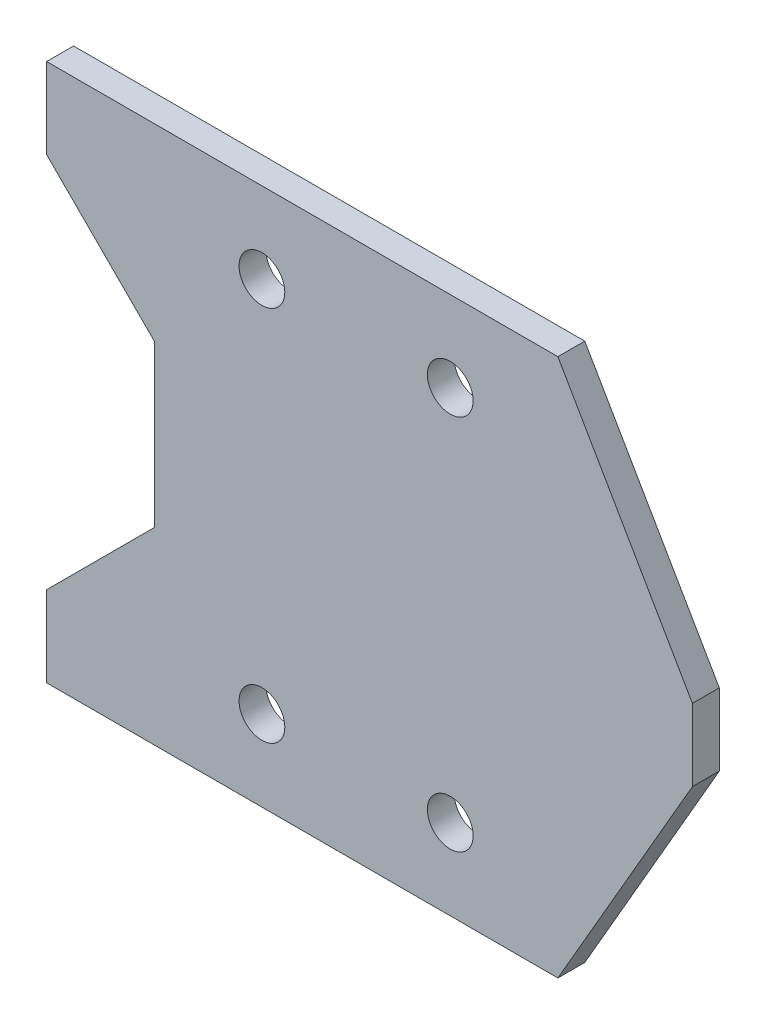
ISO-10303-21;
HEADER;
FILE_DESCRIPTION(('STEP AP214'),'2;1');
FILE_NAME('part.step','',(''),(''),'','','');
FILE_SCHEMA(('AUTOMOTIVE_DESIGN { 1 0 10303 214 1 1 1 1 }'));
ENDSEC;
DATA;
#1=APPLICATION_CONTEXT('core data for automotive mechanical design processes');
#2=APPLICATION_PROTOCOL_DEFINITION('international standard','automotive_design',2000,#1);
#3=PRODUCT_CONTEXT('',#1,'mechanical');
#4=PRODUCT('Part','Part','',(#3));
#5=PRODUCT_RELATED_PRODUCT_CATEGORY('part','',(#4));
#6=PRODUCT_DEFINITION_FORMATION('','',#4);
#7=PRODUCT_DEFINITION_CONTEXT('part definition',#1,'design');
#8=PRODUCT_DEFINITION('design','',#6,#7);
#9=PRODUCT_DEFINITION_SHAPE('','',#8);
#10=(LENGTH_UNIT() NAMED_UNIT(*) SI_UNIT(.MILLI.,.METRE.));
#11=(NAMED_UNIT(*) PLANE_ANGLE_UNIT() SI_UNIT($,.RADIAN.));
#12=(NAMED_UNIT(*) SI_UNIT($,.STERADIAN.) SOLID_ANGLE_UNIT());
#13=UNCERTAINTY_MEASURE_WITH_UNIT(LENGTH_MEASURE(1.E-05),#10,'distance_accuracy_value','');
#14=(GEOMETRIC_REPRESENTATION_CONTEXT(3) GLOBAL_UNCERTAINTY_ASSIGNED_CONTEXT((#13)) GLOBAL_UNIT_ASSIGNED_CONTEXT((#10,
#11,#12)) REPRESENTATION_CONTEXT('',''));
#15=CARTESIAN_POINT('',(0.,0.,0.));
#16=DIRECTION('',(0.,0.,1.));
#17=DIRECTION('',(1.,0.,0.));
#18=AXIS2_PLACEMENT_3D('',#15,#16,#17);
#19=CARTESIAN_POINT('',(0.,0.,5.));
#20=DIRECTION('',(0.,0.,-1.));
#21=DIRECTION('',(-1.,0.,0.));
#22=AXIS2_PLACEMENT_3D('',#19,#20,#21);
#23=PLANE('',#22);
#24=DIRECTION('',(-0.499999999999998,0.86602540378444,0.));
#25=VECTOR('',#24,1.);
#26=CARTESIAN_POINT('',(75.,50.,5.));
#27=LINE('',#26,#25);
#28=CARTESIAN_POINT('',(100.,6.69872981077782,5.));
#29=VERTEX_POINT('',#28);
#30=CARTESIAN_POINT('',(75.,50.,5.));
#31=VERTEX_POINT('',#30);
#32=EDGE_CURVE('E161',#29,#31,#27,.T.);
#33=ORIENTED_EDGE('',*,*,#32,.T.);
#34=DIRECTION('',(-1.,0.,0.));
#35=VECTOR('',#34,1.);
#36=CARTESIAN_POINT('',(-20.,50.,5.));
#37=LINE('',#36,#35);
#38=CARTESIAN_POINT('',(-20.,50.,5.));
#39=VERTEX_POINT('',#38);
#40=EDGE_CURVE('E99',#31,#39,#37,.T.);
#41=ORIENTED_EDGE('',*,*,#40,.T.);
#42=DIRECTION('',(0.,-1.,0.));
#43=VECTOR('',#42,1.);
#44=CARTESIAN_POINT('',(-20.,35.0000000000001,5.));
#45=LINE('',#44,#43);
#46=CARTESIAN_POINT('',(-20.,35.0000000000001,5.));
#47=VERTEX_POINT('',#46);
#48=EDGE_CURVE('E182',#39,#47,#45,.T.);
#49=ORIENTED_EDGE('',*,*,#48,.T.);
#50=DIRECTION('',(0.707106781186546,-0.707106781186549,0.));
#51=VECTOR('',#50,1.);
#52=CARTESIAN_POINT('',(0.,15.,5.));
#53=LINE('',#52,#51);
#54=CARTESIAN_POINT('',(0.,15.,5.));
#55=VERTEX_POINT('',#54);
#56=EDGE_CURVE('E201',#47,#55,#53,.T.);
#57=ORIENTED_EDGE('',*,*,#56,.T.);
#58=DIRECTION('',(0.,-1.,0.));
#59=VECTOR('',#58,1.);
#60=CARTESIAN_POINT('',(0.,15.,5.));
#61=LINE('',#60,#59);
#62=CARTESIAN_POINT('',(0.,-15.,5.));
#63=VERTEX_POINT('',#62);
#64=EDGE_CURVE('E198',#55,#63,#61,.T.);
#65=ORIENTED_EDGE('',*,*,#64,.T.);
#66=DIRECTION('',(-0.707106781186546,-0.707106781186549,0.));
#67=VECTOR('',#66,1.);
#68=CARTESIAN_POINT('',(0.,-15.,5.));
#69=LINE('',#68,#67);
#70=CARTESIAN_POINT('',(-20.,-35.0000000000001,5.));
#71=VERTEX_POINT('',#70);
#72=EDGE_CURVE('E200',#63,#71,#69,.T.);
#73=ORIENTED_EDGE('',*,*,#72,.T.);
#74=DIRECTION('',(0.,-1.,0.));
#75=VECTOR('',#74,1.);
#76=CARTESIAN_POINT('',(-20.,-35.0000000000001,5.));
#77=LINE('',#76,#75);
#78=CARTESIAN_POINT('',(-20.,-50.,5.));
#79=VERTEX_POINT('',#78);
#80=EDGE_CURVE('E124',#71,#79,#77,.T.);
#81=ORIENTED_EDGE('',*,*,#80,.T.);
#82=DIRECTION('',(1.,0.,0.));
#83=VECTOR('',#82,1.);
#84=CARTESIAN_POINT('',(-20.,-50.,5.));
#85=LINE('',#84,#83);
#86=CARTESIAN_POINT('',(75.,-50.,5.));
#87=VERTEX_POINT('',#86);
#88=EDGE_CURVE('E118',#79,#87,#85,.T.);
#89=ORIENTED_EDGE('',*,*,#88,.T.);
#90=DIRECTION('',(0.499999999999998,0.86602540378444,0.));
#91=VECTOR('',#90,1.);
#92=CARTESIAN_POINT('',(75.,-50.,5.));
#93=LINE('',#92,#91);
#94=CARTESIAN_POINT('',(100.,-6.69872981077784,5.));
#95=VERTEX_POINT('',#94);
#96=EDGE_CURVE('E122',#87,#95,#93,.T.);
#97=ORIENTED_EDGE('',*,*,#96,.T.);
#98=DIRECTION('',(0.,1.,0.));
#99=VECTOR('',#98,1.);
#100=CARTESIAN_POINT('',(100.,-6.69872981077784,5.));
#101=LINE('',#100,#99);
#102=EDGE_CURVE('E50',#95,#29,#101,.T.);
#103=ORIENTED_EDGE('',*,*,#102,.T.);
#104=EDGE_LOOP('',(#33,#41,#49,#57,#65,#73,#81,#89,#97,#103));
#105=FACE_BOUND('',#104,.T.);
#106=CARTESIAN_POINT('',(20.,35.,5.));
#107=DIRECTION('',(0.,0.,1.));
#108=DIRECTION('',(1.,0.,0.));
#109=AXIS2_PLACEMENT_3D('',#106,#107,#108);
#110=CIRCLE('',#109,4.25);
#111=CARTESIAN_POINT('',(24.25,35.,5.));
#112=VERTEX_POINT('',#111);
#113=EDGE_CURVE('E146',#112,#112,#110,.T.);
#114=ORIENTED_EDGE('',*,*,#113,.F.);
#115=EDGE_LOOP('',(#114));
#116=FACE_BOUND('',#115,.T.);
#117=CARTESIAN_POINT('',(55.,35.,5.));
#118=DIRECTION('',(0.,0.,1.));
#119=DIRECTION('',(1.,0.,0.));
#120=AXIS2_PLACEMENT_3D('',#117,#118,#119);
#121=CIRCLE('',#120,4.25000000000001);
#122=CARTESIAN_POINT('',(59.25,35.,5.));
#123=VERTEX_POINT('',#122);
#124=EDGE_CURVE('E212',#123,#123,#121,.T.);
#125=ORIENTED_EDGE('',*,*,#124,.F.);
#126=EDGE_LOOP('',(#125));
#127=FACE_BOUND('',#126,.T.);
#128=CARTESIAN_POINT('',(20.,-35.,5.));
#129=DIRECTION('',(0.,0.,1.));
#130=DIRECTION('',(1.,0.,0.));
#131=AXIS2_PLACEMENT_3D('',#128,#129,#130);
#132=CIRCLE('',#131,4.25);
#133=CARTESIAN_POINT('',(24.25,-35.,5.));
#134=VERTEX_POINT('',#133);
#135=EDGE_CURVE('E218',#134,#134,#132,.T.);
#136=ORIENTED_EDGE('',*,*,#135,.F.);
#137=EDGE_LOOP('',(#136));
#138=FACE_BOUND('',#137,.T.);
#139=CARTESIAN_POINT('',(55.,-35.,5.));
#140=DIRECTION('',(0.,0.,1.));
#141=DIRECTION('',(1.,0.,0.));
#142=AXIS2_PLACEMENT_3D('',#139,#140,#141);
#143=CIRCLE('',#142,4.25000000000003);
#144=CARTESIAN_POINT('',(59.25,-35.,5.));
#145=VERTEX_POINT('',#144);
#146=EDGE_CURVE('E224',#145,#145,#143,.T.);
#147=ORIENTED_EDGE('',*,*,#146,.F.);
#148=EDGE_LOOP('',(#147));
#149=FACE_BOUND('',#148,.T.);
#150=ADVANCED_FACE('F33',(#105,#116,#127,#138,#149),#23,.F.);
#151=CARTESIAN_POINT('',(0.,0.,0.));
#152=DIRECTION('',(0.,0.,-1.));
#153=DIRECTION('',(-1.,0.,0.));
#154=AXIS2_PLACEMENT_3D('',#151,#152,#153);
#155=PLANE('',#154);
#156=CARTESIAN_POINT('',(20.,-35.,0.));
#157=DIRECTION('',(0.,0.,1.));
#158=DIRECTION('',(1.,0.,0.));
#159=AXIS2_PLACEMENT_3D('',#156,#157,#158);
#160=CIRCLE('',#159,4.25);
#161=CARTESIAN_POINT('',(24.25,-35.,0.));
#162=VERTEX_POINT('',#161);
#163=EDGE_CURVE('E221',#162,#162,#160,.T.);
#164=ORIENTED_EDGE('',*,*,#163,.T.);
#165=EDGE_LOOP('',(#164));
#166=FACE_BOUND('',#165,.T.);
#167=CARTESIAN_POINT('',(20.,35.,0.));
#168=DIRECTION('',(0.,0.,1.));
#169=DIRECTION('',(1.,0.,0.));
#170=AXIS2_PLACEMENT_3D('',#167,#168,#169);
#171=CIRCLE('',#170,4.25);
#172=CARTESIAN_POINT('',(24.25,35.,0.));
#173=VERTEX_POINT('',#172);
#174=EDGE_CURVE('E209',#173,#173,#171,.T.);
#175=ORIENTED_EDGE('',*,*,#174,.T.);
#176=EDGE_LOOP('',(#175));
#177=FACE_BOUND('',#176,.T.);
#178=DIRECTION('',(-0.499999999999998,0.86602540378444,0.));
#179=VECTOR('',#178,1.);
#180=CARTESIAN_POINT('',(75.,50.,0.));
#181=LINE('',#180,#179);
#182=CARTESIAN_POINT('',(100.,6.69872981077782,0.));
#183=VERTEX_POINT('',#182);
#184=CARTESIAN_POINT('',(75.,50.,0.));
#185=VERTEX_POINT('',#184);
#186=EDGE_CURVE('E142',#183,#185,#181,.T.);
#187=ORIENTED_EDGE('',*,*,#186,.F.);
#188=DIRECTION('',(0.,1.,0.));
#189=VECTOR('',#188,1.);
#190=CARTESIAN_POINT('',(100.,-6.69872981077784,0.));
#191=LINE('',#190,#189);
#192=CARTESIAN_POINT('',(100.,-6.69872981077784,0.));
#193=VERTEX_POINT('',#192);
#194=EDGE_CURVE('E91',#193,#183,#191,.T.);
#195=ORIENTED_EDGE('',*,*,#194,.F.);
#196=DIRECTION('',(0.499999999999998,0.86602540378444,0.));
#197=VECTOR('',#196,1.);
#198=CARTESIAN_POINT('',(75.,-50.,0.));
#199=LINE('',#198,#197);
#200=CARTESIAN_POINT('',(75.,-50.,0.));
#201=VERTEX_POINT('',#200);
#202=EDGE_CURVE('E85',#201,#193,#199,.T.);
#203=ORIENTED_EDGE('',*,*,#202,.F.);
#204=DIRECTION('',(1.,0.,0.));
#205=VECTOR('',#204,1.);
#206=CARTESIAN_POINT('',(-20.,-50.,0.));
#207=LINE('',#206,#205);
#208=CARTESIAN_POINT('',(-20.,-50.,0.));
#209=VERTEX_POINT('',#208);
#210=EDGE_CURVE('E132',#209,#201,#207,.T.);
#211=ORIENTED_EDGE('',*,*,#210,.F.);
#212=DIRECTION('',(0.,-1.,0.));
#213=VECTOR('',#212,1.);
#214=CARTESIAN_POINT('',(-20.,-35.0000000000001,0.));
#215=LINE('',#214,#213);
#216=CARTESIAN_POINT('',(-20.,-35.0000000000001,0.));
#217=VERTEX_POINT('',#216);
#218=EDGE_CURVE('E156',#217,#209,#215,.T.);
#219=ORIENTED_EDGE('',*,*,#218,.F.);
#220=DIRECTION('',(-0.707106781186546,-0.707106781186549,0.));
#221=VECTOR('',#220,1.);
#222=CARTESIAN_POINT('',(0.,-15.,0.));
#223=LINE('',#222,#221);
#224=CARTESIAN_POINT('',(0.,-15.,0.));
#225=VERTEX_POINT('',#224);
#226=EDGE_CURVE('E154',#225,#217,#223,.T.);
#227=ORIENTED_EDGE('',*,*,#226,.F.);
#228=DIRECTION('',(0.,-1.,0.));
#229=VECTOR('',#228,1.);
#230=CARTESIAN_POINT('',(0.,15.,0.));
#231=LINE('',#230,#229);
#232=CARTESIAN_POINT('',(0.,15.,0.));
#233=VERTEX_POINT('',#232);
#234=EDGE_CURVE('E152',#233,#225,#231,.T.);
#235=ORIENTED_EDGE('',*,*,#234,.F.);
#236=DIRECTION('',(0.707106781186546,-0.707106781186549,0.));
#237=VECTOR('',#236,1.);
#238=CARTESIAN_POINT('',(0.,15.,0.));
#239=LINE('',#238,#237);
#240=CARTESIAN_POINT('',(-20.,35.0000000000001,0.));
#241=VERTEX_POINT('',#240);
#242=EDGE_CURVE('E150',#241,#233,#239,.T.);
#243=ORIENTED_EDGE('',*,*,#242,.F.);
#244=DIRECTION('',(0.,-1.,0.));
#245=VECTOR('',#244,1.);
#246=CARTESIAN_POINT('',(-20.,35.0000000000001,0.));
#247=LINE('',#246,#245);
#248=CARTESIAN_POINT('',(-20.,50.,0.));
#249=VERTEX_POINT('',#248);
#250=EDGE_CURVE('E148',#249,#241,#247,.T.);
#251=ORIENTED_EDGE('',*,*,#250,.F.);
#252=DIRECTION('',(-1.,0.,0.));
#253=VECTOR('',#252,1.);
#254=CARTESIAN_POINT('',(-20.,50.,0.));
#255=LINE('',#254,#253);
#256=EDGE_CURVE('E145',#185,#249,#255,.T.);
#257=ORIENTED_EDGE('',*,*,#256,.F.);
#258=EDGE_LOOP('',(#187,#195,#203,#211,#219,#227,#235,#243,#251,#257));
#259=FACE_BOUND('',#258,.T.);
#260=CARTESIAN_POINT('',(55.,35.,0.));
#261=DIRECTION('',(0.,0.,1.));
#262=DIRECTION('',(1.,0.,0.));
#263=AXIS2_PLACEMENT_3D('',#260,#261,#262);
#264=CIRCLE('',#263,4.25000000000001);
#265=CARTESIAN_POINT('',(59.25,35.,0.));
#266=VERTEX_POINT('',#265);
#267=EDGE_CURVE('E215',#266,#266,#264,.T.);
#268=ORIENTED_EDGE('',*,*,#267,.T.);
#269=EDGE_LOOP('',(#268));
#270=FACE_BOUND('',#269,.T.);
#271=CARTESIAN_POINT('',(55.,-35.,0.));
#272=DIRECTION('',(0.,0.,1.));
#273=DIRECTION('',(1.,0.,0.));
#274=AXIS2_PLACEMENT_3D('',#271,#272,#273);
#275=CIRCLE('',#274,4.25000000000003);
#276=CARTESIAN_POINT('',(59.25,-35.,0.));
#277=VERTEX_POINT('',#276);
#278=EDGE_CURVE('E227',#277,#277,#275,.T.);
#279=ORIENTED_EDGE('',*,*,#278,.T.);
#280=EDGE_LOOP('',(#279));
#281=FACE_BOUND('',#280,.T.);
#282=ADVANCED_FACE('F186',(#166,#177,#259,#270,#281),#155,.T.);
#283=CARTESIAN_POINT('',(75.,50.,5.));
#284=DIRECTION('',(-0.86602540378444,-0.499999999999998,0.));
#285=DIRECTION('',(0.499999999999998,-0.86602540378444,0.));
#286=AXIS2_PLACEMENT_3D('',#283,#284,#285);
#287=PLANE('',#286);
#288=ORIENTED_EDGE('',*,*,#186,.T.);
#289=DIRECTION('',(0.,0.,-1.));
#290=VECTOR('',#289,1.);
#291=CARTESIAN_POINT('',(75.,50.,5.));
#292=LINE('',#291,#290);
#293=EDGE_CURVE('E11',#31,#185,#292,.T.);
#294=ORIENTED_EDGE('',*,*,#293,.F.);
#295=ORIENTED_EDGE('',*,*,#32,.F.);
#296=DIRECTION('',(0.,0.,-1.));
#297=VECTOR('',#296,1.);
#298=CARTESIAN_POINT('',(100.,6.69872981077782,5.));
#299=LINE('',#298,#297);
#300=EDGE_CURVE('E138',#29,#183,#299,.T.);
#301=ORIENTED_EDGE('',*,*,#300,.T.);
#302=EDGE_LOOP('',(#288,#294,#295,#301));
#303=FACE_BOUND('',#302,.T.);
#304=ADVANCED_FACE('F35',(#303),#287,.F.);
#305=CARTESIAN_POINT('',(-20.,50.,5.));
#306=DIRECTION('',(0.,-1.,0.));
#307=DIRECTION('',(1.,0.,0.));
#308=AXIS2_PLACEMENT_3D('',#305,#306,#307);
#309=PLANE('',#308);
#310=ORIENTED_EDGE('',*,*,#256,.T.);
#311=DIRECTION('',(0.,0.,-1.));
#312=VECTOR('',#311,1.);
#313=CARTESIAN_POINT('',(-20.,50.,5.));
#314=LINE('',#313,#312);
#315=EDGE_CURVE('E42',#39,#249,#314,.T.);
#316=ORIENTED_EDGE('',*,*,#315,.F.);
#317=ORIENTED_EDGE('',*,*,#40,.F.);
#318=ORIENTED_EDGE('',*,*,#293,.T.);
#319=EDGE_LOOP('',(#310,#316,#317,#318));
#320=FACE_BOUND('',#319,.T.);
#321=ADVANCED_FACE('F267',(#320),#309,.F.);
#322=CARTESIAN_POINT('',(-20.,35.0000000000001,5.));
#323=DIRECTION('',(1.,0.,0.));
#324=DIRECTION('',(0.,0.,-1.));
#325=AXIS2_PLACEMENT_3D('',#322,#323,#324);
#326=PLANE('',#325);
#327=ORIENTED_EDGE('',*,*,#250,.T.);
#328=DIRECTION('',(0.,0.,-1.));
#329=VECTOR('',#328,1.);
#330=CARTESIAN_POINT('',(-20.,35.0000000000001,5.));
#331=LINE('',#330,#329);
#332=EDGE_CURVE('E174',#47,#241,#331,.T.);
#333=ORIENTED_EDGE('',*,*,#332,.F.);
#334=ORIENTED_EDGE('',*,*,#48,.F.);
#335=ORIENTED_EDGE('',*,*,#315,.T.);
#336=EDGE_LOOP('',(#327,#333,#334,#335));
#337=FACE_BOUND('',#336,.T.);
#338=ADVANCED_FACE('F180',(#337),#326,.F.);
#339=CARTESIAN_POINT('',(0.,15.,5.));
#340=DIRECTION('',(0.707106781186549,0.707106781186546,0.));
#341=DIRECTION('',(-0.707106781186546,0.707106781186549,0.));
#342=AXIS2_PLACEMENT_3D('',#339,#340,#341);
#343=PLANE('',#342);
#344=ORIENTED_EDGE('',*,*,#242,.T.);
#345=DIRECTION('',(0.,0.,-1.));
#346=VECTOR('',#345,1.);
#347=CARTESIAN_POINT('',(0.,15.,5.));
#348=LINE('',#347,#346);
#349=EDGE_CURVE('E171',#55,#233,#348,.T.);
#350=ORIENTED_EDGE('',*,*,#349,.F.);
#351=ORIENTED_EDGE('',*,*,#56,.F.);
#352=ORIENTED_EDGE('',*,*,#332,.T.);
#353=EDGE_LOOP('',(#344,#350,#351,#352));
#354=FACE_BOUND('',#353,.T.);
#355=ADVANCED_FACE('F192',(#354),#343,.F.);
#356=CARTESIAN_POINT('',(0.,15.,5.));
#357=DIRECTION('',(1.,0.,0.));
#358=DIRECTION('',(0.,0.,-1.));
#359=AXIS2_PLACEMENT_3D('',#356,#357,#358);
#360=PLANE('',#359);
#361=ORIENTED_EDGE('',*,*,#234,.T.);
#362=DIRECTION('',(0.,0.,-1.));
#363=VECTOR('',#362,1.);
#364=CARTESIAN_POINT('',(0.,-15.,5.));
#365=LINE('',#364,#363);
#366=EDGE_CURVE('E168',#63,#225,#365,.T.);
#367=ORIENTED_EDGE('',*,*,#366,.F.);
#368=ORIENTED_EDGE('',*,*,#64,.F.);
#369=ORIENTED_EDGE('',*,*,#349,.T.);
#370=EDGE_LOOP('',(#361,#367,#368,#369));
#371=FACE_BOUND('',#370,.T.);
#372=ADVANCED_FACE('F196',(#371),#360,.F.);
#373=CARTESIAN_POINT('',(0.,-15.,5.));
#374=DIRECTION('',(0.707106781186549,-0.707106781186546,0.));
#375=DIRECTION('',(0.707106781186546,0.707106781186549,0.));
#376=AXIS2_PLACEMENT_3D('',#373,#374,#375);
#377=PLANE('',#376);
#378=ORIENTED_EDGE('',*,*,#226,.T.);
#379=DIRECTION('',(0.,0.,-1.));
#380=VECTOR('',#379,1.);
#381=CARTESIAN_POINT('',(-20.,-35.0000000000001,5.));
#382=LINE('',#381,#380);
#383=EDGE_CURVE('E165',#71,#217,#382,.T.);
#384=ORIENTED_EDGE('',*,*,#383,.F.);
#385=ORIENTED_EDGE('',*,*,#72,.F.);
#386=ORIENTED_EDGE('',*,*,#366,.T.);
#387=EDGE_LOOP('',(#378,#384,#385,#386));
#388=FACE_BOUND('',#387,.T.);
#389=ADVANCED_FACE('F257',(#388),#377,.F.);
#390=CARTESIAN_POINT('',(-20.,-35.0000000000001,5.));
#391=DIRECTION('',(1.,0.,0.));
#392=DIRECTION('',(0.,0.,-1.));
#393=AXIS2_PLACEMENT_3D('',#390,#391,#392);
#394=PLANE('',#393);
#395=ORIENTED_EDGE('',*,*,#218,.T.);
#396=DIRECTION('',(0.,0.,-1.));
#397=VECTOR('',#396,1.);
#398=CARTESIAN_POINT('',(-20.,-50.,5.));
#399=LINE('',#398,#397);
#400=EDGE_CURVE('E133',#79,#209,#399,.T.);
#401=ORIENTED_EDGE('',*,*,#400,.F.);
#402=ORIENTED_EDGE('',*,*,#80,.F.);
#403=ORIENTED_EDGE('',*,*,#383,.T.);
#404=EDGE_LOOP('',(#395,#401,#402,#403));
#405=FACE_BOUND('',#404,.T.);
#406=ADVANCED_FACE('F254',(#405),#394,.F.);
#407=CARTESIAN_POINT('',(-20.,-50.,5.));
#408=DIRECTION('',(0.,1.,0.));
#409=DIRECTION('',(-1.,0.,0.));
#410=AXIS2_PLACEMENT_3D('',#407,#408,#409);
#411=PLANE('',#410);
#412=ORIENTED_EDGE('',*,*,#210,.T.);
#413=DIRECTION('',(0.,0.,-1.));
#414=VECTOR('',#413,1.);
#415=CARTESIAN_POINT('',(75.,-50.,5.));
#416=LINE('',#415,#414);
#417=EDGE_CURVE('E129',#87,#201,#416,.T.);
#418=ORIENTED_EDGE('',*,*,#417,.F.);
#419=ORIENTED_EDGE('',*,*,#88,.F.);
#420=ORIENTED_EDGE('',*,*,#400,.T.);
#421=EDGE_LOOP('',(#412,#418,#419,#420));
#422=FACE_BOUND('',#421,.T.);
#423=ADVANCED_FACE('F130',(#422),#411,.F.);
#424=CARTESIAN_POINT('',(75.,-50.,5.));
#425=DIRECTION('',(-0.86602540378444,0.499999999999998,0.));
#426=DIRECTION('',(-0.499999999999998,-0.86602540378444,0.));
#427=AXIS2_PLACEMENT_3D('',#424,#425,#426);
#428=PLANE('',#427);
#429=ORIENTED_EDGE('',*,*,#202,.T.);
#430=DIRECTION('',(0.,0.,-1.));
#431=VECTOR('',#430,1.);
#432=CARTESIAN_POINT('',(100.,-6.69872981077784,5.));
#433=LINE('',#432,#431);
#434=EDGE_CURVE('E134',#95,#193,#433,.T.);
#435=ORIENTED_EDGE('',*,*,#434,.F.);
#436=ORIENTED_EDGE('',*,*,#96,.F.);
#437=ORIENTED_EDGE('',*,*,#417,.T.);
#438=EDGE_LOOP('',(#429,#435,#436,#437));
#439=FACE_BOUND('',#438,.T.);
#440=ADVANCED_FACE('F136',(#439),#428,.F.);
#441=CARTESIAN_POINT('',(100.,-6.69872981077784,5.));
#442=DIRECTION('',(-1.,0.,0.));
#443=DIRECTION('',(0.,0.,1.));
#444=AXIS2_PLACEMENT_3D('',#441,#442,#443);
#445=PLANE('',#444);
#446=ORIENTED_EDGE('',*,*,#194,.T.);
#447=ORIENTED_EDGE('',*,*,#300,.F.);
#448=ORIENTED_EDGE('',*,*,#102,.F.);
#449=ORIENTED_EDGE('',*,*,#434,.T.);
#450=EDGE_LOOP('',(#446,#447,#448,#449));
#451=FACE_BOUND('',#450,.T.);
#452=ADVANCED_FACE('F247',(#451),#445,.F.);
#453=CARTESIAN_POINT('',(20.,35.,5.));
#454=DIRECTION('',(0.,0.,-1.));
#455=DIRECTION('',(-1.,0.,0.));
#456=AXIS2_PLACEMENT_3D('',#453,#454,#455);
#457=CYLINDRICAL_SURFACE('',#456,4.25);
#458=ORIENTED_EDGE('',*,*,#113,.T.);
#459=EDGE_LOOP('',(#458));
#460=FACE_BOUND('',#459,.T.);
#461=ORIENTED_EDGE('',*,*,#174,.F.);
#462=EDGE_LOOP('',(#461));
#463=FACE_BOUND('',#462,.T.);
#464=ADVANCED_FACE('F244',(#460,#463),#457,.F.);
#465=CARTESIAN_POINT('',(55.,35.,5.));
#466=DIRECTION('',(0.,0.,-1.));
#467=DIRECTION('',(-1.,0.,0.));
#468=AXIS2_PLACEMENT_3D('',#465,#466,#467);
#469=CYLINDRICAL_SURFACE('',#468,4.25000000000001);
#470=ORIENTED_EDGE('',*,*,#124,.T.);
#471=EDGE_LOOP('',(#470));
#472=FACE_BOUND('',#471,.T.);
#473=ORIENTED_EDGE('',*,*,#267,.F.);
#474=EDGE_LOOP('',(#473));
#475=FACE_BOUND('',#474,.T.);
#476=ADVANCED_FACE('F343',(#472,#475),#469,.F.);
#477=CARTESIAN_POINT('',(20.,-35.,5.));
#478=DIRECTION('',(0.,0.,-1.));
#479=DIRECTION('',(-1.,0.,0.));
#480=AXIS2_PLACEMENT_3D('',#477,#478,#479);
#481=CYLINDRICAL_SURFACE('',#480,4.25);
#482=ORIENTED_EDGE('',*,*,#135,.T.);
#483=EDGE_LOOP('',(#482));
#484=FACE_BOUND('',#483,.T.);
#485=ORIENTED_EDGE('',*,*,#163,.F.);
#486=EDGE_LOOP('',(#485));
#487=FACE_BOUND('',#486,.T.);
#488=ADVANCED_FACE('F351',(#484,#487),#481,.F.);
#489=CARTESIAN_POINT('',(55.,-35.,5.));
#490=DIRECTION('',(0.,0.,-1.));
#491=DIRECTION('',(-1.,0.,0.));
#492=AXIS2_PLACEMENT_3D('',#489,#490,#491);
#493=CYLINDRICAL_SURFACE('',#492,4.25000000000003);
#494=ORIENTED_EDGE('',*,*,#146,.T.);
#495=EDGE_LOOP('',(#494));
#496=FACE_BOUND('',#495,.T.);
#497=ORIENTED_EDGE('',*,*,#278,.F.);
#498=EDGE_LOOP('',(#497));
#499=FACE_BOUND('',#498,.T.);
#500=ADVANCED_FACE('F233',(#496,#499),#493,.F.);
#501=CLOSED_SHELL('',(#150,#282,#304,#321,#338,#355,#372,#389,#406,#423,#440,#452,#464,#476,
#488,#500));
#502=MANIFOLD_SOLID_BREP('B2',#501);
#503=ADVANCED_BREP_SHAPE_REPRESENTATION('',(#18,#502),#14);
#504=SHAPE_DEFINITION_REPRESENTATION(#9,#503);
ENDSEC;
END-ISO-10303-21;
